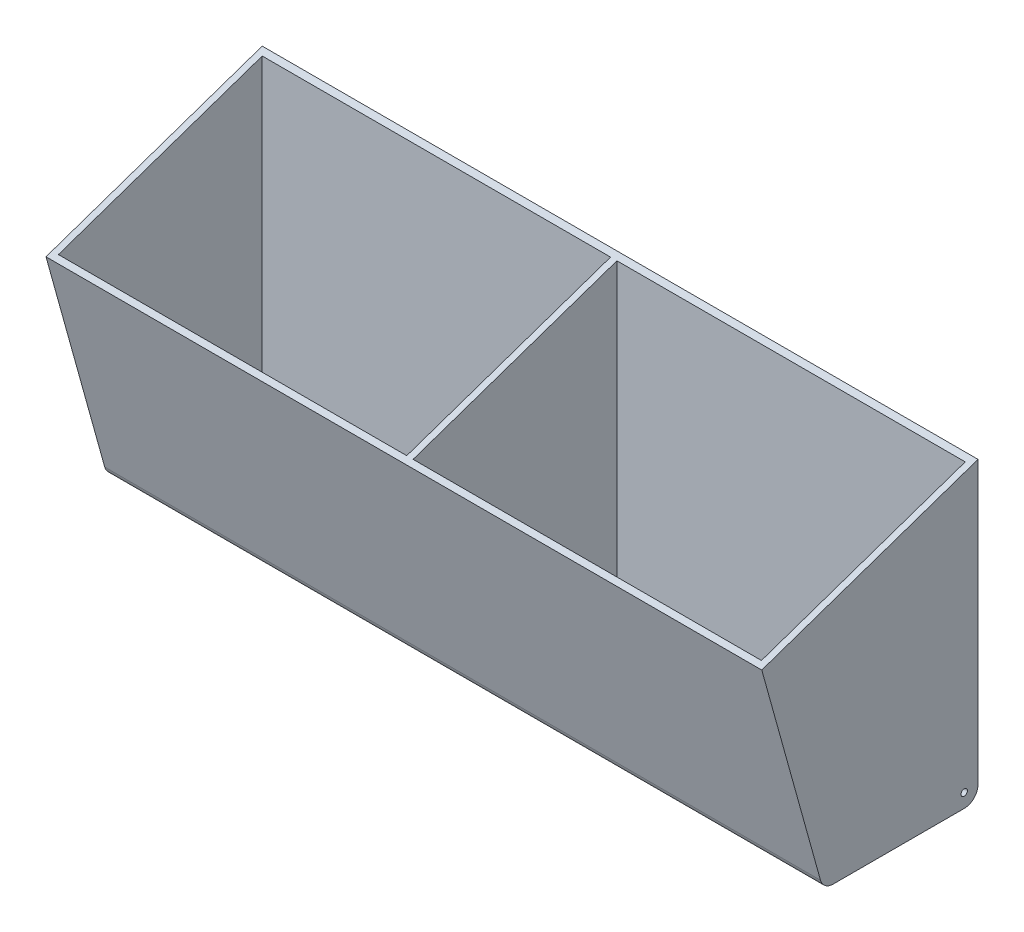
ISO-10303-21;
HEADER;
FILE_DESCRIPTION(('STEP AP214'),'2;1');
FILE_NAME('part.step','',(''),(''),'','','');
FILE_SCHEMA(('AUTOMOTIVE_DESIGN { 1 0 10303 214 1 1 1 1 }'));
ENDSEC;
DATA;
#1=APPLICATION_CONTEXT('core data for automotive mechanical design processes');
#2=APPLICATION_PROTOCOL_DEFINITION('international standard','automotive_design',2000,#1);
#3=PRODUCT_CONTEXT('',#1,'mechanical');
#4=PRODUCT('Part','Part','',(#3));
#5=PRODUCT_RELATED_PRODUCT_CATEGORY('part','',(#4));
#6=PRODUCT_DEFINITION_FORMATION('','',#4);
#7=PRODUCT_DEFINITION_CONTEXT('part definition',#1,'design');
#8=PRODUCT_DEFINITION('design','',#6,#7);
#9=PRODUCT_DEFINITION_SHAPE('','',#8);
#10=(LENGTH_UNIT() NAMED_UNIT(*) SI_UNIT(.MILLI.,.METRE.));
#11=(NAMED_UNIT(*) PLANE_ANGLE_UNIT() SI_UNIT($,.RADIAN.));
#12=(NAMED_UNIT(*) SI_UNIT($,.STERADIAN.) SOLID_ANGLE_UNIT());
#13=UNCERTAINTY_MEASURE_WITH_UNIT(LENGTH_MEASURE(1.E-05),#10,'distance_accuracy_value','');
#14=(GEOMETRIC_REPRESENTATION_CONTEXT(3) GLOBAL_UNCERTAINTY_ASSIGNED_CONTEXT((#13)) GLOBAL_UNIT_ASSIGNED_CONTEXT((#10,
#11,#12)) REPRESENTATION_CONTEXT('',''));
#15=CARTESIAN_POINT('',(0.,0.,0.));
#16=DIRECTION('',(0.,0.,1.));
#17=DIRECTION('',(1.,0.,0.));
#18=AXIS2_PLACEMENT_3D('',#15,#16,#17);
#19=CARTESIAN_POINT('',(0.,0.,-104.4));
#20=DIRECTION('',(0.,0.,-1.));
#21=DIRECTION('',(0.,1.,0.));
#22=AXIS2_PLACEMENT_3D('',#19,#20,#21);
#23=PLANE('',#22);
#24=DIRECTION('',(0.,1.,0.));
#25=VECTOR('',#24,1.);
#26=CARTESIAN_POINT('',(163.5,-318.691488077077,-104.4));
#27=LINE('',#26,#25);
#28=CARTESIAN_POINT('',(163.5,-318.691488077077,-104.4));
#29=VERTEX_POINT('',#28);
#30=CARTESIAN_POINT('',(163.5,-187.122908946168,-104.4));
#31=VERTEX_POINT('',#30);
#32=EDGE_CURVE('E430',#29,#31,#27,.T.);
#33=ORIENTED_EDGE('',*,*,#32,.T.);
#34=DIRECTION('',(1.,0.,0.));
#35=VECTOR('',#34,1.);
#36=CARTESIAN_POINT('',(-111.148687869384,-187.122908946168,-104.4));
#37=LINE('',#36,#35);
#38=CARTESIAN_POINT('',(-0.499999999999991,-187.122908946168,-104.4));
#39=VERTEX_POINT('',#38);
#40=EDGE_CURVE('E211',#39,#31,#37,.T.);
#41=ORIENTED_EDGE('',*,*,#40,.F.);
#42=DIRECTION('',(0.,1.,0.));
#43=VECTOR('',#42,1.);
#44=CARTESIAN_POINT('',(-0.499999999999973,0.,-104.4));
#45=LINE('',#44,#43);
#46=CARTESIAN_POINT('',(-0.500000000000003,-318.691488077077,-104.4));
#47=VERTEX_POINT('',#46);
#48=EDGE_CURVE('E223',#47,#39,#45,.T.);
#49=ORIENTED_EDGE('',*,*,#48,.F.);
#50=DIRECTION('',(-1.,0.,0.));
#51=VECTOR('',#50,1.);
#52=CARTESIAN_POINT('',(330.5,-318.691488077077,-104.4));
#53=LINE('',#52,#51);
#54=EDGE_CURVE('E270',#47,#29,#53,.F.);
#55=ORIENTED_EDGE('',*,*,#54,.T.);
#56=EDGE_LOOP('',(#33,#41,#49,#55));
#57=FACE_BOUND('',#56,.T.);
#58=ADVANCED_FACE('F44',(#57),#23,.F.);
#59=CARTESIAN_POINT('',(333.5,-322.191488077078,368.978954006394));
#60=DIRECTION('',(0.,-1.,0.));
#61=DIRECTION('',(0.,0.,-1.));
#62=AXIS2_PLACEMENT_3D('',#59,#60,#61);
#63=PLANE('',#62);
#64=DIRECTION('',(0.,0.,-1.));
#65=VECTOR('',#64,1.);
#66=CARTESIAN_POINT('',(163.5,-322.191488077077,-39.2235636653926));
#67=LINE('',#66,#65);
#68=CARTESIAN_POINT('',(163.5,-322.191488077077,-39.2235636653926));
#69=VERTEX_POINT('',#68);
#70=CARTESIAN_POINT('',(163.5,-322.191488077077,-100.9));
#71=VERTEX_POINT('',#70);
#72=EDGE_CURVE('E168',#69,#71,#67,.T.);
#73=ORIENTED_EDGE('',*,*,#72,.T.);
#74=DIRECTION('',(-1.,0.,0.));
#75=VECTOR('',#74,1.);
#76=CARTESIAN_POINT('',(-0.5,-322.191488077077,-100.9));
#77=LINE('',#76,#75);
#78=CARTESIAN_POINT('',(-0.5,-322.191488077077,-100.9));
#79=VERTEX_POINT('',#78);
#80=EDGE_CURVE('E258',#71,#79,#77,.T.);
#81=ORIENTED_EDGE('',*,*,#80,.T.);
#82=DIRECTION('',(0.,0.,-1.));
#83=VECTOR('',#82,1.);
#84=CARTESIAN_POINT('',(-0.5,-322.191488077078,368.978954006394));
#85=LINE('',#84,#83);
#86=CARTESIAN_POINT('',(-0.5,-322.191488077077,-39.2235636653926));
#87=VERTEX_POINT('',#86);
#88=EDGE_CURVE('E191',#87,#79,#85,.T.);
#89=ORIENTED_EDGE('',*,*,#88,.F.);
#90=DIRECTION('',(1.,0.,0.));
#91=VECTOR('',#90,1.);
#92=CARTESIAN_POINT('',(333.5,-322.191488077077,-39.2235636653926));
#93=LINE('',#92,#91);
#94=EDGE_CURVE('E183',#69,#87,#93,.F.);
#95=ORIENTED_EDGE('',*,*,#94,.F.);
#96=EDGE_LOOP('',(#73,#81,#89,#95));
#97=FACE_BOUND('',#96,.T.);
#98=ADVANCED_FACE('F189',(#97),#63,.F.);
#99=CARTESIAN_POINT('',(-111.540019033806,-220.288695131296,-8.49059593602104));
#100=DIRECTION('',(0.,0.267593210065538,-0.963531978673682));
#101=DIRECTION('',(0.,0.963531978673682,0.267593210065538));
#102=AXIS2_PLACEMENT_3D('',#99,#100,#101);
#103=PLANE('',#102);
#104=DIRECTION('',(1.,0.,0.));
#105=VECTOR('',#104,1.);
#106=CARTESIAN_POINT('',(-111.148687869384,-220.11430623689,-8.4421644515589));
#107=LINE('',#106,#105);
#108=CARTESIAN_POINT('',(-0.499999999999994,-220.11430623689,-8.44216445155889));
#109=VERTEX_POINT('',#108);
#110=CARTESIAN_POINT('',(163.5,-220.11430623689,-8.44216445155889));
#111=VERTEX_POINT('',#110);
#112=EDGE_CURVE('E220',#109,#111,#107,.T.);
#113=ORIENTED_EDGE('',*,*,#112,.T.);
#114=DIRECTION('',(0.,-0.963531978673682,-0.267593210065538));
#115=VECTOR('',#114,1.);
#116=CARTESIAN_POINT('',(163.5,-220.11430623689,-8.44216445155889));
#117=LINE('',#116,#115);
#118=CARTESIAN_POINT('',(163.5,-319.847786349287,-36.1402613336369));
#119=VERTEX_POINT('',#118);
#120=EDGE_CURVE('E263',#111,#119,#117,.T.);
#121=ORIENTED_EDGE('',*,*,#120,.T.);
#122=DIRECTION('',(1.,0.,0.));
#123=VECTOR('',#122,1.);
#124=CARTESIAN_POINT('',(-111.540019033806,-319.847786349287,-36.1402613336369));
#125=LINE('',#124,#123);
#126=CARTESIAN_POINT('',(-0.5,-319.847786349287,-36.1402613336369));
#127=VERTEX_POINT('',#126);
#128=EDGE_CURVE('E186',#127,#119,#125,.T.);
#129=ORIENTED_EDGE('',*,*,#128,.F.);
#130=DIRECTION('',(0.,0.963531978673682,0.267593210065538));
#131=VECTOR('',#130,1.);
#132=CARTESIAN_POINT('',(-0.499999999999987,-220.288695131296,-8.49059593602104));
#133=LINE('',#132,#131);
#134=EDGE_CURVE('E206',#127,#109,#133,.T.);
#135=ORIENTED_EDGE('',*,*,#134,.T.);
#136=EDGE_LOOP('',(#113,#121,#129,#135));
#137=FACE_BOUND('',#136,.T.);
#138=ADVANCED_FACE('F327',(#137),#103,.T.);
#139=CARTESIAN_POINT('',(-111.540019033806,-318.991488077077,-39.2235636653927));
#140=DIRECTION('',(-1.,0.,0.));
#141=DIRECTION('',(0.,0.,1.));
#142=AXIS2_PLACEMENT_3D('',#139,#140,#141);
#143=CYLINDRICAL_SURFACE('',#142,3.2);
#144=CARTESIAN_POINT('',(163.5,-318.991488077077,-39.2235636653927));
#145=DIRECTION('',(1.,0.,0.));
#146=DIRECTION('',(0.,0.,-1.));
#147=AXIS2_PLACEMENT_3D('',#144,#145,#146);
#148=CIRCLE('',#147,3.19999999999999);
#149=EDGE_CURVE('E172',#119,#69,#148,.T.);
#150=ORIENTED_EDGE('',*,*,#149,.T.);
#151=ORIENTED_EDGE('',*,*,#94,.T.);
#152=CARTESIAN_POINT('',(-0.5,-318.991488077077,-39.2235636653927));
#153=DIRECTION('',(-1.,0.,0.));
#154=DIRECTION('',(0.,-1.,0.));
#155=AXIS2_PLACEMENT_3D('',#152,#153,#154);
#156=CIRCLE('',#155,3.2);
#157=EDGE_CURVE('E197',#87,#127,#156,.T.);
#158=ORIENTED_EDGE('',*,*,#157,.T.);
#159=ORIENTED_EDGE('',*,*,#128,.T.);
#160=EDGE_LOOP('',(#150,#151,#158,#159));
#161=FACE_BOUND('',#160,.T.);
#162=ADVANCED_FACE('F182',(#161),#143,.F.);
#163=CARTESIAN_POINT('',(333.5,-318.691488077077,-100.9));
#164=DIRECTION('',(1.,0.,0.));
#165=DIRECTION('',(0.,0.,-1.));
#166=AXIS2_PLACEMENT_3D('',#163,#164,#165);
#167=CYLINDRICAL_SURFACE('',#166,3.5);
#168=CARTESIAN_POINT('',(163.5,-318.691488077077,-100.9));
#169=DIRECTION('',(1.,0.,0.));
#170=DIRECTION('',(0.,0.,-1.));
#171=AXIS2_PLACEMENT_3D('',#168,#169,#170);
#172=CIRCLE('',#171,3.5);
#173=EDGE_CURVE('E175',#71,#29,#172,.T.);
#174=ORIENTED_EDGE('',*,*,#173,.T.);
#175=ORIENTED_EDGE('',*,*,#54,.F.);
#176=CARTESIAN_POINT('',(-0.5,-318.691488077077,-100.9));
#177=DIRECTION('',(-1.,0.,0.));
#178=DIRECTION('',(0.,-1.,0.));
#179=AXIS2_PLACEMENT_3D('',#176,#177,#178);
#180=CIRCLE('',#179,3.5);
#181=EDGE_CURVE('E267',#79,#47,#180,.F.);
#182=ORIENTED_EDGE('',*,*,#181,.F.);
#183=ORIENTED_EDGE('',*,*,#80,.F.);
#184=EDGE_LOOP('',(#174,#175,#182,#183));
#185=FACE_BOUND('',#184,.T.);
#186=ADVANCED_FACE('F355',(#185),#167,.F.);
#187=CARTESIAN_POINT('',(-111.148687869384,-186.091474761492,-107.4));
#188=DIRECTION('',(0.,-0.94566874910282,-0.325131691734762));
#189=DIRECTION('',(0.,0.325131691734762,-0.94566874910282));
#190=AXIS2_PLACEMENT_3D('',#187,#188,#189);
#191=PLANE('',#190);
#192=DIRECTION('',(0.,-0.325131691734762,0.94566874910282));
#193=VECTOR('',#192,1.);
#194=CARTESIAN_POINT('',(166.5,-187.122908946168,-104.4));
#195=LINE('',#194,#193);
#196=CARTESIAN_POINT('',(166.5,-187.122908946168,-104.4));
#197=VERTEX_POINT('',#196);
#198=CARTESIAN_POINT('',(166.5,-220.11430623689,-8.44216445155889));
#199=VERTEX_POINT('',#198);
#200=EDGE_CURVE('E398',#197,#199,#195,.T.);
#201=ORIENTED_EDGE('',*,*,#200,.F.);
#202=CARTESIAN_POINT('',(330.5,-187.122908946168,-104.4));
#203=VERTEX_POINT('',#202);
#204=EDGE_CURVE('E215',#197,#203,#37,.T.);
#205=ORIENTED_EDGE('',*,*,#204,.T.);
#206=DIRECTION('',(0.,0.325131691734762,-0.94566874910282));
#207=VECTOR('',#206,1.);
#208=CARTESIAN_POINT('',(330.5,-332.562225550636,318.620640866708));
#209=LINE('',#208,#207);
#210=CARTESIAN_POINT('',(330.5,-220.11430623689,-8.44216445155889));
#211=VERTEX_POINT('',#210);
#212=EDGE_CURVE('E208',#211,#203,#209,.T.);
#213=ORIENTED_EDGE('',*,*,#212,.F.);
#214=EDGE_CURVE('E219',#199,#211,#107,.T.);
#215=ORIENTED_EDGE('',*,*,#214,.F.);
#216=EDGE_LOOP('',(#201,#205,#213,#215));
#217=FACE_BOUND('',#216,.T.);
#218=DIRECTION('',(1.,0.,0.));
#219=VECTOR('',#218,1.);
#220=CARTESIAN_POINT('',(-111.148687869384,-221.091474761492,-5.59999999999999));
#221=LINE('',#220,#219);
#222=CARTESIAN_POINT('',(-3.49999999999999,-221.091474761492,-5.6));
#223=VERTEX_POINT('',#222);
#224=CARTESIAN_POINT('',(333.5,-221.091474761492,-5.59999999999999));
#225=VERTEX_POINT('',#224);
#226=EDGE_CURVE('E234',#223,#225,#221,.T.);
#227=ORIENTED_EDGE('',*,*,#226,.T.);
#228=DIRECTION('',(0.,0.325131691734762,-0.94566874910282));
#229=VECTOR('',#228,1.);
#230=CARTESIAN_POINT('',(333.5,-186.091474761492,-107.4));
#231=LINE('',#230,#229);
#232=CARTESIAN_POINT('',(333.5,-186.091474761492,-107.4));
#233=VERTEX_POINT('',#232);
#234=EDGE_CURVE('E229',#225,#233,#231,.T.);
#235=ORIENTED_EDGE('',*,*,#234,.T.);
#236=DIRECTION('',(1.,0.,0.));
#237=VECTOR('',#236,1.);
#238=CARTESIAN_POINT('',(-3.49999999999999,-186.091474761492,-107.4));
#239=LINE('',#238,#237);
#240=CARTESIAN_POINT('',(-3.49999999999999,-186.091474761492,-107.4));
#241=VERTEX_POINT('',#240);
#242=EDGE_CURVE('E242',#241,#233,#239,.T.);
#243=ORIENTED_EDGE('',*,*,#242,.F.);
#244=DIRECTION('',(0.,0.325131691734762,-0.94566874910282));
#245=VECTOR('',#244,1.);
#246=CARTESIAN_POINT('',(-3.49999999999999,-186.091474761492,-107.4));
#247=LINE('',#246,#245);
#248=EDGE_CURVE('E231',#223,#241,#247,.T.);
#249=ORIENTED_EDGE('',*,*,#248,.F.);
#250=EDGE_LOOP('',(#227,#235,#243,#249));
#251=FACE_BOUND('',#250,.T.);
#252=ORIENTED_EDGE('',*,*,#112,.F.);
#253=DIRECTION('',(0.,0.325131691734762,-0.94566874910282));
#254=VECTOR('',#253,1.);
#255=CARTESIAN_POINT('',(-0.499999999999987,-186.091474761492,-107.4));
#256=LINE('',#255,#254);
#257=EDGE_CURVE('E216',#109,#39,#256,.T.);
#258=ORIENTED_EDGE('',*,*,#257,.T.);
#259=ORIENTED_EDGE('',*,*,#40,.T.);
#260=DIRECTION('',(0.,-0.325131691734762,0.94566874910282));
#261=VECTOR('',#260,1.);
#262=CARTESIAN_POINT('',(163.5,-187.122908946168,-104.4));
#263=LINE('',#262,#261);
#264=EDGE_CURVE('E428',#31,#111,#263,.T.);
#265=ORIENTED_EDGE('',*,*,#264,.T.);
#266=EDGE_LOOP('',(#252,#258,#259,#265));
#267=FACE_BOUND('',#266,.T.);
#268=ADVANCED_FACE('F298',(#217,#251,#267),#191,.F.);
#269=CARTESIAN_POINT('',(0.,0.,-107.4));
#270=DIRECTION('',(0.,0.,-1.));
#271=DIRECTION('',(0.,1.,0.));
#272=AXIS2_PLACEMENT_3D('',#269,#270,#271);
#273=PLANE('',#272);
#274=DIRECTION('',(0.,-1.,0.));
#275=VECTOR('',#274,1.);
#276=CARTESIAN_POINT('',(333.5,-186.091474761492,-107.4));
#277=LINE('',#276,#275);
#278=CARTESIAN_POINT('',(333.5,-318.691488077077,-107.4));
#279=VERTEX_POINT('',#278);
#280=EDGE_CURVE('E238',#233,#279,#277,.T.);
#281=ORIENTED_EDGE('',*,*,#280,.T.);
#282=DIRECTION('',(-1.,0.,0.));
#283=VECTOR('',#282,1.);
#284=CARTESIAN_POINT('',(0.,-318.691488077077,-107.4));
#285=LINE('',#284,#283);
#286=CARTESIAN_POINT('',(-3.5,-318.691488077077,-107.4));
#287=VERTEX_POINT('',#286);
#288=EDGE_CURVE('E275',#279,#287,#285,.T.);
#289=ORIENTED_EDGE('',*,*,#288,.T.);
#290=DIRECTION('',(0.,1.,0.));
#291=VECTOR('',#290,1.);
#292=CARTESIAN_POINT('',(-3.5,-325.191488077077,-107.4));
#293=LINE('',#292,#291);
#294=EDGE_CURVE('E237',#287,#241,#293,.T.);
#295=ORIENTED_EDGE('',*,*,#294,.T.);
#296=ORIENTED_EDGE('',*,*,#242,.T.);
#297=EDGE_LOOP('',(#281,#289,#295,#296));
#298=FACE_BOUND('',#297,.T.);
#299=ADVANCED_FACE('F294',(#298),#273,.T.);
#300=CARTESIAN_POINT('',(333.5,-186.091474761492,368.978954006394));
#301=DIRECTION('',(1.,0.,0.));
#302=DIRECTION('',(0.,0.,-1.));
#303=AXIS2_PLACEMENT_3D('',#300,#301,#302);
#304=PLANE('',#303);
#305=CARTESIAN_POINT('',(333.5,-318.691488077077,-100.9));
#306=DIRECTION('',(1.,0.,0.));
#307=DIRECTION('',(0.,0.,-1.));
#308=AXIS2_PLACEMENT_3D('',#305,#306,#307);
#309=CIRCLE('',#308,1.5);
#310=CARTESIAN_POINT('',(333.5,-318.691488077077,-102.4));
#311=VERTEX_POINT('',#310);
#312=EDGE_CURVE('E370',#311,#311,#309,.F.);
#313=ORIENTED_EDGE('',*,*,#312,.T.);
#314=EDGE_LOOP('',(#313));
#315=FACE_BOUND('',#314,.T.);
#316=DIRECTION('',(0.,0.,-1.));
#317=VECTOR('',#316,1.);
#318=CARTESIAN_POINT('',(333.5,-325.191488077078,368.978954006394));
#319=LINE('',#318,#317);
#320=CARTESIAN_POINT('',(333.5,-325.191488077077,-39.2235636653926));
#321=VERTEX_POINT('',#320);
#322=CARTESIAN_POINT('',(333.5,-325.191488077077,-100.9));
#323=VERTEX_POINT('',#322);
#324=EDGE_CURVE('E241',#321,#323,#319,.T.);
#325=ORIENTED_EDGE('',*,*,#324,.T.);
#326=CARTESIAN_POINT('',(333.5,-318.691488077077,-100.9));
#327=DIRECTION('',(1.,0.,0.));
#328=DIRECTION('',(0.,0.,-1.));
#329=AXIS2_PLACEMENT_3D('',#326,#327,#328);
#330=CIRCLE('',#329,6.5);
#331=EDGE_CURVE('E12',#323,#279,#330,.T.);
#332=ORIENTED_EDGE('',*,*,#331,.T.);
#333=ORIENTED_EDGE('',*,*,#280,.F.);
#334=ORIENTED_EDGE('',*,*,#234,.F.);
#335=DIRECTION('',(0.,0.963531978673682,0.267593210065538));
#336=VECTOR('',#335,1.);
#337=CARTESIAN_POINT('',(333.5,-221.091474761492,-5.59999999999999));
#338=LINE('',#337,#336);
#339=CARTESIAN_POINT('',(333.5,-320.650565979484,-33.2496653976158));
#340=VERTEX_POINT('',#339);
#341=EDGE_CURVE('E205',#340,#225,#338,.T.);
#342=ORIENTED_EDGE('',*,*,#341,.F.);
#343=CARTESIAN_POINT('',(333.5,-318.991488077077,-39.2235636653927));
#344=DIRECTION('',(1.,0.,0.));
#345=DIRECTION('',(0.,0.,-1.));
#346=AXIS2_PLACEMENT_3D('',#343,#344,#345);
#347=CIRCLE('',#346,6.2);
#348=EDGE_CURVE('E252',#340,#321,#347,.T.);
#349=ORIENTED_EDGE('',*,*,#348,.T.);
#350=EDGE_LOOP('',(#325,#332,#333,#334,#342,#349));
#351=FACE_BOUND('',#350,.T.);
#352=ADVANCED_FACE('F291',(#315,#351),#304,.T.);
#353=CARTESIAN_POINT('',(333.5,-325.191488077078,368.978954006394));
#354=DIRECTION('',(0.,-1.,0.));
#355=DIRECTION('',(0.,0.,-1.));
#356=AXIS2_PLACEMENT_3D('',#353,#354,#355);
#357=PLANE('',#356);
#358=DIRECTION('',(0.,0.,-1.));
#359=VECTOR('',#358,1.);
#360=CARTESIAN_POINT('',(-3.5,-325.191488077078,368.978954006394));
#361=LINE('',#360,#359);
#362=CARTESIAN_POINT('',(-3.5,-325.191488077077,-39.2235636653926));
#363=VERTEX_POINT('',#362);
#364=CARTESIAN_POINT('',(-3.5,-325.191488077077,-100.9));
#365=VERTEX_POINT('',#364);
#366=EDGE_CURVE('E246',#363,#365,#361,.T.);
#367=ORIENTED_EDGE('',*,*,#366,.T.);
#368=DIRECTION('',(-1.,0.,0.));
#369=VECTOR('',#368,1.);
#370=CARTESIAN_POINT('',(333.5,-325.191488077077,-100.9));
#371=LINE('',#370,#369);
#372=EDGE_CURVE('E52',#365,#323,#371,.F.);
#373=ORIENTED_EDGE('',*,*,#372,.T.);
#374=ORIENTED_EDGE('',*,*,#324,.F.);
#375=DIRECTION('',(1.,0.,0.));
#376=VECTOR('',#375,1.);
#377=CARTESIAN_POINT('',(-3.5,-325.191488077077,-39.2235636653927));
#378=LINE('',#377,#376);
#379=EDGE_CURVE('E254',#321,#363,#378,.F.);
#380=ORIENTED_EDGE('',*,*,#379,.T.);
#381=EDGE_LOOP('',(#367,#373,#374,#380));
#382=FACE_BOUND('',#381,.T.);
#383=ADVANCED_FACE('F286',(#382),#357,.T.);
#384=CARTESIAN_POINT('',(-3.5,-325.191488077078,368.978954006394));
#385=DIRECTION('',(-1.,0.,0.));
#386=DIRECTION('',(0.,-1.,0.));
#387=AXIS2_PLACEMENT_3D('',#384,#385,#386);
#388=PLANE('',#387);
#389=CARTESIAN_POINT('',(-3.5,-318.691488077077,-100.9));
#390=DIRECTION('',(-1.,0.,0.));
#391=DIRECTION('',(0.,-1.,0.));
#392=AXIS2_PLACEMENT_3D('',#389,#390,#391);
#393=CIRCLE('',#392,1.5);
#394=CARTESIAN_POINT('',(-3.5,-320.191488077077,-100.9));
#395=VERTEX_POINT('',#394);
#396=EDGE_CURVE('E372',#395,#395,#393,.F.);
#397=ORIENTED_EDGE('',*,*,#396,.T.);
#398=EDGE_LOOP('',(#397));
#399=FACE_BOUND('',#398,.T.);
#400=ORIENTED_EDGE('',*,*,#294,.F.);
#401=CARTESIAN_POINT('',(-3.5,-318.691488077077,-100.9));
#402=DIRECTION('',(-1.,0.,0.));
#403=DIRECTION('',(0.,-1.,0.));
#404=AXIS2_PLACEMENT_3D('',#401,#402,#403);
#405=CIRCLE('',#404,6.5);
#406=EDGE_CURVE('E278',#287,#365,#405,.T.);
#407=ORIENTED_EDGE('',*,*,#406,.T.);
#408=ORIENTED_EDGE('',*,*,#366,.F.);
#409=CARTESIAN_POINT('',(-3.5,-318.991488077077,-39.2235636653927));
#410=DIRECTION('',(-1.,0.,0.));
#411=DIRECTION('',(0.,-1.,0.));
#412=AXIS2_PLACEMENT_3D('',#409,#410,#411);
#413=CIRCLE('',#412,6.2);
#414=CARTESIAN_POINT('',(-3.5,-320.650565979484,-33.2496653976158));
#415=VERTEX_POINT('',#414);
#416=EDGE_CURVE('E256',#363,#415,#413,.T.);
#417=ORIENTED_EDGE('',*,*,#416,.T.);
#418=DIRECTION('',(0.,0.963531978673682,0.267593210065538));
#419=VECTOR('',#418,1.);
#420=CARTESIAN_POINT('',(-3.49999999999999,-221.091474761492,-5.6));
#421=LINE('',#420,#419);
#422=EDGE_CURVE('E227',#415,#223,#421,.T.);
#423=ORIENTED_EDGE('',*,*,#422,.T.);
#424=ORIENTED_EDGE('',*,*,#248,.T.);
#425=EDGE_LOOP('',(#400,#407,#408,#417,#423,#424));
#426=FACE_BOUND('',#425,.T.);
#427=ADVANCED_FACE('F282',(#399,#426),#388,.T.);
#428=CARTESIAN_POINT('',(-111.540019033806,-221.091474761492,-5.59999999999999));
#429=DIRECTION('',(0.,0.267593210065538,-0.963531978673682));
#430=DIRECTION('',(0.,0.963531978673682,0.267593210065538));
#431=AXIS2_PLACEMENT_3D('',#428,#429,#430);
#432=PLANE('',#431);
#433=ORIENTED_EDGE('',*,*,#422,.F.);
#434=DIRECTION('',(1.,0.,0.));
#435=VECTOR('',#434,1.);
#436=CARTESIAN_POINT('',(333.5,-320.650565979484,-33.2496653976158));
#437=LINE('',#436,#435);
#438=EDGE_CURVE('E248',#415,#340,#437,.T.);
#439=ORIENTED_EDGE('',*,*,#438,.T.);
#440=ORIENTED_EDGE('',*,*,#341,.T.);
#441=ORIENTED_EDGE('',*,*,#226,.F.);
#442=EDGE_LOOP('',(#433,#439,#440,#441));
#443=FACE_BOUND('',#442,.T.);
#444=ADVANCED_FACE('F304',(#443),#432,.F.);
#445=CARTESIAN_POINT('',(-111.540019033806,-318.991488077077,-39.2235636653927));
#446=DIRECTION('',(-1.,0.,0.));
#447=DIRECTION('',(0.,0.,1.));
#448=AXIS2_PLACEMENT_3D('',#445,#446,#447);
#449=CYLINDRICAL_SURFACE('',#448,6.2);
#450=ORIENTED_EDGE('',*,*,#416,.F.);
#451=ORIENTED_EDGE('',*,*,#379,.F.);
#452=ORIENTED_EDGE('',*,*,#348,.F.);
#453=ORIENTED_EDGE('',*,*,#438,.F.);
#454=EDGE_LOOP('',(#450,#451,#452,#453));
#455=FACE_BOUND('',#454,.T.);
#456=ADVANCED_FACE('F307',(#455),#449,.T.);
#457=ORIENTED_EDGE('',*,*,#204,.F.);
#458=DIRECTION('',(0.,1.,0.));
#459=VECTOR('',#458,1.);
#460=CARTESIAN_POINT('',(166.5,-318.691488077077,-104.4));
#461=LINE('',#460,#459);
#462=CARTESIAN_POINT('',(166.5,-318.691488077077,-104.4));
#463=VERTEX_POINT('',#462);
#464=EDGE_CURVE('E396',#463,#197,#461,.T.);
#465=ORIENTED_EDGE('',*,*,#464,.F.);
#466=CARTESIAN_POINT('',(330.5,-318.691488077077,-104.4));
#467=VERTEX_POINT('',#466);
#468=EDGE_CURVE('E269',#463,#467,#53,.F.);
#469=ORIENTED_EDGE('',*,*,#468,.T.);
#470=DIRECTION('',(0.,-1.,0.));
#471=VECTOR('',#470,1.);
#472=CARTESIAN_POINT('',(330.5,0.,-104.4));
#473=LINE('',#472,#471);
#474=EDGE_CURVE('E214',#203,#467,#473,.T.);
#475=ORIENTED_EDGE('',*,*,#474,.F.);
#476=EDGE_LOOP('',(#457,#465,#469,#475));
#477=FACE_BOUND('',#476,.T.);
#478=ADVANCED_FACE('F309',(#477),#23,.F.);
#479=CARTESIAN_POINT('',(330.5,-186.091474761492,368.978954006394));
#480=DIRECTION('',(1.,0.,0.));
#481=DIRECTION('',(0.,0.,-1.));
#482=AXIS2_PLACEMENT_3D('',#479,#480,#481);
#483=PLANE('',#482);
#484=CARTESIAN_POINT('',(330.5,-318.691488077077,-100.9));
#485=DIRECTION('',(1.,0.,0.));
#486=DIRECTION('',(0.,0.,-1.));
#487=AXIS2_PLACEMENT_3D('',#484,#485,#486);
#488=CIRCLE('',#487,1.5);
#489=CARTESIAN_POINT('',(330.5,-318.691488077077,-102.4));
#490=VERTEX_POINT('',#489);
#491=EDGE_CURVE('E262',#490,#490,#488,.F.);
#492=ORIENTED_EDGE('',*,*,#491,.F.);
#493=EDGE_LOOP('',(#492));
#494=FACE_BOUND('',#493,.T.);
#495=ORIENTED_EDGE('',*,*,#474,.T.);
#496=CARTESIAN_POINT('',(330.5,-318.691488077077,-100.9));
#497=DIRECTION('',(1.,0.,0.));
#498=DIRECTION('',(0.,0.,-1.));
#499=AXIS2_PLACEMENT_3D('',#496,#497,#498);
#500=CIRCLE('',#499,3.5);
#501=CARTESIAN_POINT('',(330.5,-322.191488077077,-100.9));
#502=VERTEX_POINT('',#501);
#503=EDGE_CURVE('E273',#467,#502,#500,.F.);
#504=ORIENTED_EDGE('',*,*,#503,.T.);
#505=DIRECTION('',(0.,0.,-1.));
#506=VECTOR('',#505,1.);
#507=CARTESIAN_POINT('',(330.5,-322.191488077078,368.978954006394));
#508=LINE('',#507,#506);
#509=CARTESIAN_POINT('',(330.5,-322.191488077077,-39.2235636653926));
#510=VERTEX_POINT('',#509);
#511=EDGE_CURVE('E201',#510,#502,#508,.T.);
#512=ORIENTED_EDGE('',*,*,#511,.F.);
#513=CARTESIAN_POINT('',(330.5,-318.991488077077,-39.2235636653927));
#514=DIRECTION('',(1.,0.,0.));
#515=DIRECTION('',(0.,0.,-1.));
#516=AXIS2_PLACEMENT_3D('',#513,#514,#515);
#517=CIRCLE('',#516,3.2);
#518=CARTESIAN_POINT('',(330.5,-319.847786349287,-36.1402613336369));
#519=VERTEX_POINT('',#518);
#520=EDGE_CURVE('E194',#519,#510,#517,.T.);
#521=ORIENTED_EDGE('',*,*,#520,.F.);
#522=DIRECTION('',(0.,0.963531978673682,0.267593210065538));
#523=VECTOR('',#522,1.);
#524=CARTESIAN_POINT('',(330.5,-91.2154890853054,27.3557634000134));
#525=LINE('',#524,#523);
#526=EDGE_CURVE('E209',#519,#211,#525,.T.);
#527=ORIENTED_EDGE('',*,*,#526,.T.);
#528=ORIENTED_EDGE('',*,*,#212,.T.);
#529=EDGE_LOOP('',(#495,#504,#512,#521,#527,#528));
#530=FACE_BOUND('',#529,.T.);
#531=ADVANCED_FACE('F316',(#494,#530),#483,.F.);
#532=CARTESIAN_POINT('',(166.5,-322.191488077077,-100.9));
#533=VERTEX_POINT('',#532);
#534=EDGE_CURVE('E264',#502,#533,#77,.T.);
#535=ORIENTED_EDGE('',*,*,#534,.T.);
#536=DIRECTION('',(0.,0.,-1.));
#537=VECTOR('',#536,1.);
#538=CARTESIAN_POINT('',(166.5,-322.191488077077,-39.2235636653926));
#539=LINE('',#538,#537);
#540=CARTESIAN_POINT('',(166.5,-322.191488077077,-39.2235636653926));
#541=VERTEX_POINT('',#540);
#542=EDGE_CURVE('E59',#541,#533,#539,.T.);
#543=ORIENTED_EDGE('',*,*,#542,.F.);
#544=EDGE_CURVE('E193',#510,#541,#93,.F.);
#545=ORIENTED_EDGE('',*,*,#544,.F.);
#546=ORIENTED_EDGE('',*,*,#511,.T.);
#547=EDGE_LOOP('',(#535,#543,#545,#546));
#548=FACE_BOUND('',#547,.T.);
#549=ADVANCED_FACE('F329',(#548),#63,.F.);
#550=CARTESIAN_POINT('',(-0.500000000000003,-325.191488077078,368.978954006394));
#551=DIRECTION('',(-1.,0.,0.));
#552=DIRECTION('',(0.,-1.,0.));
#553=AXIS2_PLACEMENT_3D('',#550,#551,#552);
#554=PLANE('',#553);
#555=CARTESIAN_POINT('',(-0.500000000000004,-318.691488077077,-100.9));
#556=DIRECTION('',(-1.,0.,0.));
#557=DIRECTION('',(0.,-1.,0.));
#558=AXIS2_PLACEMENT_3D('',#555,#556,#557);
#559=CIRCLE('',#558,1.5);
#560=CARTESIAN_POINT('',(-0.500000000000004,-320.191488077077,-100.9));
#561=VERTEX_POINT('',#560);
#562=EDGE_CURVE('E259',#561,#561,#559,.F.);
#563=ORIENTED_EDGE('',*,*,#562,.F.);
#564=EDGE_LOOP('',(#563));
#565=FACE_BOUND('',#564,.T.);
#566=ORIENTED_EDGE('',*,*,#88,.T.);
#567=ORIENTED_EDGE('',*,*,#181,.T.);
#568=ORIENTED_EDGE('',*,*,#48,.T.);
#569=ORIENTED_EDGE('',*,*,#257,.F.);
#570=ORIENTED_EDGE('',*,*,#134,.F.);
#571=ORIENTED_EDGE('',*,*,#157,.F.);
#572=EDGE_LOOP('',(#566,#567,#568,#569,#570,#571));
#573=FACE_BOUND('',#572,.T.);
#574=ADVANCED_FACE('F339',(#565,#573),#554,.F.);
#575=DIRECTION('',(0.,-0.963531978673682,-0.267593210065538));
#576=VECTOR('',#575,1.);
#577=CARTESIAN_POINT('',(166.5,-220.11430623689,-8.44216445155889));
#578=LINE('',#577,#576);
#579=CARTESIAN_POINT('',(166.5,-319.847786349287,-36.1402613336369));
#580=VERTEX_POINT('',#579);
#581=EDGE_CURVE('E187',#199,#580,#578,.T.);
#582=ORIENTED_EDGE('',*,*,#581,.F.);
#583=ORIENTED_EDGE('',*,*,#214,.T.);
#584=ORIENTED_EDGE('',*,*,#526,.F.);
#585=EDGE_CURVE('E203',#580,#519,#125,.T.);
#586=ORIENTED_EDGE('',*,*,#585,.F.);
#587=EDGE_LOOP('',(#582,#583,#584,#586));
#588=FACE_BOUND('',#587,.T.);
#589=ADVANCED_FACE('F343',(#588),#103,.T.);
#590=ORIENTED_EDGE('',*,*,#544,.T.);
#591=CARTESIAN_POINT('',(166.5,-318.991488077077,-39.2235636653927));
#592=DIRECTION('',(1.,0.,0.));
#593=DIRECTION('',(0.,0.,-1.));
#594=AXIS2_PLACEMENT_3D('',#591,#592,#593);
#595=CIRCLE('',#594,3.19999999999999);
#596=EDGE_CURVE('E400',#580,#541,#595,.T.);
#597=ORIENTED_EDGE('',*,*,#596,.F.);
#598=ORIENTED_EDGE('',*,*,#585,.T.);
#599=ORIENTED_EDGE('',*,*,#520,.T.);
#600=EDGE_LOOP('',(#590,#597,#598,#599));
#601=FACE_BOUND('',#600,.T.);
#602=ADVANCED_FACE('F347',(#601),#143,.F.);
#603=CARTESIAN_POINT('',(-19.2426406871193,-318.691488077077,-100.9));
#604=DIRECTION('',(1.,0.,0.));
#605=DIRECTION('',(0.,1.,0.));
#606=AXIS2_PLACEMENT_3D('',#603,#604,#605);
#607=CYLINDRICAL_SURFACE('',#606,1.5);
#608=ORIENTED_EDGE('',*,*,#396,.F.);
#609=EDGE_LOOP('',(#608));
#610=FACE_BOUND('',#609,.T.);
#611=ORIENTED_EDGE('',*,*,#562,.T.);
#612=EDGE_LOOP('',(#611));
#613=FACE_BOUND('',#612,.T.);
#614=ADVANCED_FACE('F350',(#610,#613),#607,.F.);
#615=ORIENTED_EDGE('',*,*,#312,.F.);
#616=EDGE_LOOP('',(#615));
#617=FACE_BOUND('',#616,.T.);
#618=ORIENTED_EDGE('',*,*,#491,.T.);
#619=EDGE_LOOP('',(#618));
#620=FACE_BOUND('',#619,.T.);
#621=ADVANCED_FACE('F333',(#617,#620),#607,.F.);
#622=ORIENTED_EDGE('',*,*,#468,.F.);
#623=CARTESIAN_POINT('',(166.5,-318.691488077077,-100.9));
#624=DIRECTION('',(1.,0.,0.));
#625=DIRECTION('',(0.,0.,-1.));
#626=AXIS2_PLACEMENT_3D('',#623,#624,#625);
#627=CIRCLE('',#626,3.5);
#628=EDGE_CURVE('E393',#533,#463,#627,.T.);
#629=ORIENTED_EDGE('',*,*,#628,.F.);
#630=ORIENTED_EDGE('',*,*,#534,.F.);
#631=ORIENTED_EDGE('',*,*,#503,.F.);
#632=EDGE_LOOP('',(#622,#629,#630,#631));
#633=FACE_BOUND('',#632,.T.);
#634=ADVANCED_FACE('F392',(#633),#167,.F.);
#635=CARTESIAN_POINT('',(0.,-318.691488077077,-100.9));
#636=DIRECTION('',(-1.,0.,0.));
#637=DIRECTION('',(0.,0.,1.));
#638=AXIS2_PLACEMENT_3D('',#635,#636,#637);
#639=CYLINDRICAL_SURFACE('',#638,6.5);
#640=ORIENTED_EDGE('',*,*,#331,.F.);
#641=ORIENTED_EDGE('',*,*,#372,.F.);
#642=ORIENTED_EDGE('',*,*,#406,.F.);
#643=ORIENTED_EDGE('',*,*,#288,.F.);
#644=EDGE_LOOP('',(#640,#641,#642,#643));
#645=FACE_BOUND('',#644,.T.);
#646=ADVANCED_FACE('F46',(#645),#639,.T.);
#647=CARTESIAN_POINT('',(163.5,-318.991488077077,-39.2235636653927));
#648=DIRECTION('',(1.,0.,0.));
#649=DIRECTION('',(0.,0.,-1.));
#650=AXIS2_PLACEMENT_3D('',#647,#648,#649);
#651=PLANE('',#650);
#652=ORIENTED_EDGE('',*,*,#149,.F.);
#653=ORIENTED_EDGE('',*,*,#120,.F.);
#654=ORIENTED_EDGE('',*,*,#264,.F.);
#655=ORIENTED_EDGE('',*,*,#32,.F.);
#656=ORIENTED_EDGE('',*,*,#173,.F.);
#657=ORIENTED_EDGE('',*,*,#72,.F.);
#658=EDGE_LOOP('',(#652,#653,#654,#655,#656,#657));
#659=FACE_BOUND('',#658,.T.);
#660=ADVANCED_FACE('F170',(#659),#651,.F.);
#661=CARTESIAN_POINT('',(166.5,-318.991488077077,-39.2235636653927));
#662=DIRECTION('',(1.,0.,0.));
#663=DIRECTION('',(0.,0.,-1.));
#664=AXIS2_PLACEMENT_3D('',#661,#662,#663);
#665=PLANE('',#664);
#666=ORIENTED_EDGE('',*,*,#596,.T.);
#667=ORIENTED_EDGE('',*,*,#542,.T.);
#668=ORIENTED_EDGE('',*,*,#628,.T.);
#669=ORIENTED_EDGE('',*,*,#464,.T.);
#670=ORIENTED_EDGE('',*,*,#200,.T.);
#671=ORIENTED_EDGE('',*,*,#581,.T.);
#672=EDGE_LOOP('',(#666,#667,#668,#669,#670,#671));
#673=FACE_BOUND('',#672,.T.);
#674=ADVANCED_FACE('F434',(#673),#665,.T.);
#675=CLOSED_SHELL('',(#58,#98,#138,#162,#186,#268,#299,#352,#383,#427,#444,#456,#478,#531,#549,
#574,#589,#602,#614,#621,#634,#646,#660,#674));
#676=MANIFOLD_SOLID_BREP('B2',#675);
#677=ADVANCED_BREP_SHAPE_REPRESENTATION('',(#18,#676),#14);
#678=SHAPE_DEFINITION_REPRESENTATION(#9,#677);
ENDSEC;
END-ISO-10303-21;
